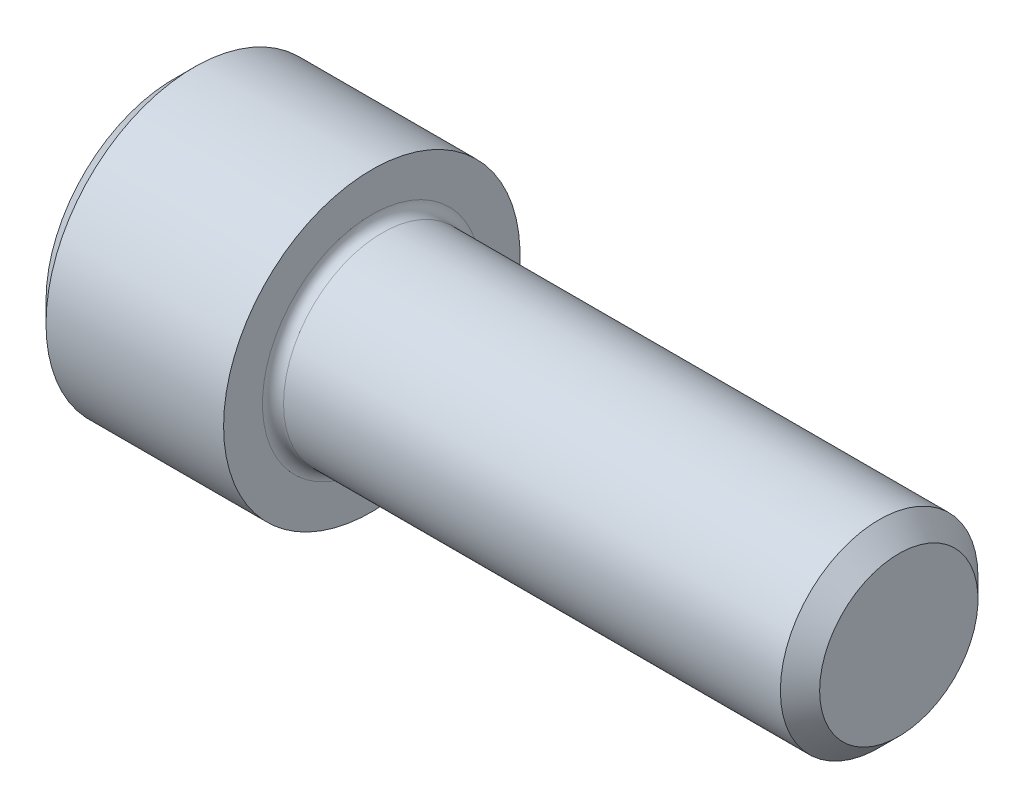
ISO-10303-21;
HEADER;
FILE_DESCRIPTION(('STEP AP214'),'2;1');
FILE_NAME('part.step','',(''),(''),'','','');
FILE_SCHEMA(('AUTOMOTIVE_DESIGN { 1 0 10303 214 1 1 1 1 }'));
ENDSEC;
DATA;
#1=APPLICATION_CONTEXT('core data for automotive mechanical design processes');
#2=APPLICATION_PROTOCOL_DEFINITION('international standard','automotive_design',2000,#1);
#3=PRODUCT_CONTEXT('',#1,'mechanical');
#4=PRODUCT('Part','Part','',(#3));
#5=PRODUCT_RELATED_PRODUCT_CATEGORY('part','',(#4));
#6=PRODUCT_DEFINITION_FORMATION('','',#4);
#7=PRODUCT_DEFINITION_CONTEXT('part definition',#1,'design');
#8=PRODUCT_DEFINITION('design','',#6,#7);
#9=PRODUCT_DEFINITION_SHAPE('','',#8);
#10=(LENGTH_UNIT() NAMED_UNIT(*) SI_UNIT(.MILLI.,.METRE.));
#11=(NAMED_UNIT(*) PLANE_ANGLE_UNIT() SI_UNIT($,.RADIAN.));
#12=(NAMED_UNIT(*) SI_UNIT($,.STERADIAN.) SOLID_ANGLE_UNIT());
#13=UNCERTAINTY_MEASURE_WITH_UNIT(LENGTH_MEASURE(1.E-05),#10,'distance_accuracy_value','');
#14=(GEOMETRIC_REPRESENTATION_CONTEXT(3) GLOBAL_UNCERTAINTY_ASSIGNED_CONTEXT((#13)) GLOBAL_UNIT_ASSIGNED_CONTEXT((#10,
#11,#12)) REPRESENTATION_CONTEXT('',''));
#15=CARTESIAN_POINT('',(0.,0.,0.));
#16=DIRECTION('',(0.,0.,1.));
#17=DIRECTION('',(1.,0.,0.));
#18=AXIS2_PLACEMENT_3D('',#15,#16,#17);
#19=CARTESIAN_POINT('',(-59.1087632408478,-4.02672579360797,7.12011919364386));
#20=DIRECTION('',(-1.,0.,0.));
#21=DIRECTION('',(0.,0.,1.));
#22=AXIS2_PLACEMENT_3D('',#19,#20,#21);
#23=PLANE('',#22);
#24=DIRECTION('',(0.,-0.499999999999998,0.86602540378444));
#25=VECTOR('',#24,1.);
#26=CARTESIAN_POINT('',(-59.1087632408478,0.555991968084691,7.12011919364385));
#27=LINE('',#26,#25);
#28=CARTESIAN_POINT('',(-59.1087632408478,0.555991968084691,7.12011919364385));
#29=VERTEX_POINT('',#28);
#30=CARTESIAN_POINT('',(-59.1087632408478,-1.73536691276163,11.0888691936439));
#31=VERTEX_POINT('',#30);
#32=EDGE_CURVE('E242',#29,#31,#27,.T.);
#33=ORIENTED_EDGE('',*,*,#32,.T.);
#34=DIRECTION('',(0.,1.,0.));
#35=VECTOR('',#34,1.);
#36=CARTESIAN_POINT('',(-59.1087632408478,-6.31808467445428,11.0888691936439));
#37=LINE('',#36,#35);
#38=CARTESIAN_POINT('',(-59.1087632408478,-6.31808467445428,11.0888691936439));
#39=VERTEX_POINT('',#38);
#40=EDGE_CURVE('E112',#39,#31,#37,.T.);
#41=ORIENTED_EDGE('',*,*,#40,.F.);
#42=DIRECTION('',(0.,-0.500000000000001,-0.866025403784438));
#43=VECTOR('',#42,1.);
#44=CARTESIAN_POINT('',(-59.1087632408478,-6.31808467445428,11.0888691936439));
#45=LINE('',#44,#43);
#46=CARTESIAN_POINT('',(-59.1087632408478,-8.60944355530061,7.12011919364386));
#47=VERTEX_POINT('',#46);
#48=EDGE_CURVE('E245',#39,#47,#45,.T.);
#49=ORIENTED_EDGE('',*,*,#48,.T.);
#50=DIRECTION('',(0.,0.499999999999998,-0.86602540378444));
#51=VECTOR('',#50,1.);
#52=CARTESIAN_POINT('',(-59.1087632408478,-8.60944355530061,7.12011919364386));
#53=LINE('',#52,#51);
#54=CARTESIAN_POINT('',(-59.1087632408478,-6.31808467445429,3.15136919364386));
#55=VERTEX_POINT('',#54);
#56=EDGE_CURVE('E248',#47,#55,#53,.T.);
#57=ORIENTED_EDGE('',*,*,#56,.T.);
#58=DIRECTION('',(0.,-1.,0.));
#59=VECTOR('',#58,1.);
#60=CARTESIAN_POINT('',(-59.1087632408478,-1.73536691276164,3.15136919364386));
#61=LINE('',#60,#59);
#62=CARTESIAN_POINT('',(-59.1087632408478,-1.73536691276164,3.15136919364386));
#63=VERTEX_POINT('',#62);
#64=EDGE_CURVE('E251',#63,#55,#61,.T.);
#65=ORIENTED_EDGE('',*,*,#64,.F.);
#66=DIRECTION('',(0.,-0.500000000000001,-0.866025403784438));
#67=VECTOR('',#66,1.);
#68=CARTESIAN_POINT('',(-59.1087632408478,0.555991968084691,7.12011919364385));
#69=LINE('',#68,#67);
#70=EDGE_CURVE('E107',#29,#63,#69,.T.);
#71=ORIENTED_EDGE('',*,*,#70,.F.);
#72=EDGE_LOOP('',(#33,#41,#49,#57,#65,#71));
#73=FACE_BOUND('',#72,.T.);
#74=CARTESIAN_POINT('',(-59.1087632408478,-4.02672579360797,7.12011919364386));
#75=DIRECTION('',(-1.,0.,0.));
#76=DIRECTION('',(0.,0.,1.));
#77=AXIS2_PLACEMENT_3D('',#74,#75,#76);
#78=CIRCLE('',#77,6.17855);
#79=CARTESIAN_POINT('',(-59.1087632408478,-4.02672579360797,13.2986691936439));
#80=VERTEX_POINT('',#79);
#81=EDGE_CURVE('E136',#80,#80,#78,.T.);
#82=ORIENTED_EDGE('',*,*,#81,.T.);
#83=EDGE_LOOP('',(#82));
#84=FACE_BOUND('',#83,.T.);
#85=ADVANCED_FACE('F16',(#73,#84),#23,.T.);
#86=CARTESIAN_POINT('',(-59.1087632408478,-4.02672579360797,7.12011919364386));
#87=DIRECTION('',(1.,0.,0.));
#88=DIRECTION('',(0.,0.,-1.));
#89=AXIS2_PLACEMENT_3D('',#86,#87,#88);
#90=CONICAL_SURFACE('',#89,6.17855,0.785398163397447);
#91=CARTESIAN_POINT('',(-58.1435632408478,-4.02672579360797,7.12011919364386));
#92=DIRECTION('',(-1.,0.,0.));
#93=DIRECTION('',(0.,0.,1.));
#94=AXIS2_PLACEMENT_3D('',#91,#92,#93);
#95=CIRCLE('',#94,7.14375);
#96=CARTESIAN_POINT('',(-58.1435632408478,-4.02672579360797,14.2638691936439));
#97=VERTEX_POINT('',#96);
#98=EDGE_CURVE('E133',#97,#97,#95,.T.);
#99=ORIENTED_EDGE('',*,*,#98,.T.);
#100=EDGE_LOOP('',(#99));
#101=FACE_BOUND('',#100,.T.);
#102=ORIENTED_EDGE('',*,*,#81,.F.);
#103=EDGE_LOOP('',(#102));
#104=FACE_BOUND('',#103,.T.);
#105=ADVANCED_FACE('F158',(#101,#104),#90,.T.);
#106=CARTESIAN_POINT('',(-90.8587632408478,-4.02672579360797,7.12011919364386));
#107=DIRECTION('',(-1.,0.,0.));
#108=DIRECTION('',(0.,0.,1.));
#109=AXIS2_PLACEMENT_3D('',#106,#107,#108);
#110=CYLINDRICAL_SURFACE('',#109,7.14375);
#111=CARTESIAN_POINT('',(-49.5837632408478,-4.02672579360797,7.12011919364386));
#112=DIRECTION('',(-1.,0.,0.));
#113=DIRECTION('',(0.,0.,1.));
#114=AXIS2_PLACEMENT_3D('',#111,#112,#113);
#115=CIRCLE('',#114,7.14375);
#116=CARTESIAN_POINT('',(-49.5837632408478,-4.02672579360797,14.2638691936439));
#117=VERTEX_POINT('',#116);
#118=EDGE_CURVE('E130',#117,#117,#115,.T.);
#119=ORIENTED_EDGE('',*,*,#118,.T.);
#120=EDGE_LOOP('',(#119));
#121=FACE_BOUND('',#120,.T.);
#122=ORIENTED_EDGE('',*,*,#98,.F.);
#123=EDGE_LOOP('',(#122));
#124=FACE_BOUND('',#123,.T.);
#125=ADVANCED_FACE('F163',(#121,#124),#110,.T.);
#126=CARTESIAN_POINT('',(-49.5837632408478,3.11702420639203,7.12011919364386));
#127=DIRECTION('',(1.,0.,0.));
#128=DIRECTION('',(0.,0.,-1.));
#129=AXIS2_PLACEMENT_3D('',#126,#127,#128);
#130=PLANE('',#129);
#131=CARTESIAN_POINT('',(-49.5837632408478,-4.02672579360797,7.12011919364386));
#132=DIRECTION('',(1.,0.,0.));
#133=DIRECTION('',(0.,0.,-1.));
#134=AXIS2_PLACEMENT_3D('',#131,#132,#133);
#135=CIRCLE('',#134,5.27049999999997);
#136=CARTESIAN_POINT('',(-49.5837632408478,-4.02672579360797,1.84961919364389));
#137=VERTEX_POINT('',#136);
#138=EDGE_CURVE('E24',#137,#137,#135,.F.);
#139=ORIENTED_EDGE('',*,*,#138,.T.);
#140=EDGE_LOOP('',(#139));
#141=FACE_BOUND('',#140,.T.);
#142=ORIENTED_EDGE('',*,*,#118,.F.);
#143=EDGE_LOOP('',(#142));
#144=FACE_BOUND('',#143,.T.);
#145=ADVANCED_FACE('F141',(#141,#144),#130,.T.);
#146=CARTESIAN_POINT('',(-90.8587632408478,-4.02672579360797,7.12011919364386));
#147=DIRECTION('',(-1.,0.,0.));
#148=DIRECTION('',(0.,0.,1.));
#149=AXIS2_PLACEMENT_3D('',#146,#147,#148);
#150=CYLINDRICAL_SURFACE('',#149,4.76249999999997);
#151=CARTESIAN_POINT('',(-49.0757632408478,-4.02672579360797,7.12011919364386));
#152=DIRECTION('',(1.,0.,0.));
#153=DIRECTION('',(0.,0.,-1.));
#154=AXIS2_PLACEMENT_3D('',#151,#152,#153);
#155=CIRCLE('',#154,4.76249999999997);
#156=CARTESIAN_POINT('',(-49.0757632408478,-4.02672579360797,2.35761919364389));
#157=VERTEX_POINT('',#156);
#158=EDGE_CURVE('E10',#157,#157,#155,.T.);
#159=ORIENTED_EDGE('',*,*,#158,.T.);
#160=EDGE_LOOP('',(#159));
#161=FACE_BOUND('',#160,.T.);
#162=CARTESIAN_POINT('',(-25.1299132408479,-4.02672579360797,7.12011919364386));
#163=DIRECTION('',(-1.,0.,0.));
#164=DIRECTION('',(0.,0.,1.));
#165=AXIS2_PLACEMENT_3D('',#162,#163,#164);
#166=CIRCLE('',#165,4.76249999999993);
#167=CARTESIAN_POINT('',(-25.1299132408479,-4.02672579360797,11.8826191936438));
#168=VERTEX_POINT('',#167);
#169=EDGE_CURVE('E127',#168,#168,#166,.T.);
#170=ORIENTED_EDGE('',*,*,#169,.T.);
#171=EDGE_LOOP('',(#170));
#172=FACE_BOUND('',#171,.T.);
#173=ADVANCED_FACE('F173',(#161,#172),#150,.T.);
#174=CARTESIAN_POINT('',(-24.1837632408478,-4.02672579360797,7.12011919364386));
#175=DIRECTION('',(-1.,0.,0.));
#176=DIRECTION('',(0.,0.,1.));
#177=AXIS2_PLACEMENT_3D('',#174,#175,#176);
#178=CONICAL_SURFACE('',#177,3.81635,0.785398163397395);
#179=ORIENTED_EDGE('',*,*,#169,.F.);
#180=EDGE_LOOP('',(#179));
#181=FACE_BOUND('',#180,.T.);
#182=CARTESIAN_POINT('',(-24.1837632408478,-4.02672579360797,7.12011919364386));
#183=DIRECTION('',(-1.,0.,0.));
#184=DIRECTION('',(0.,0.,1.));
#185=AXIS2_PLACEMENT_3D('',#182,#183,#184);
#186=CIRCLE('',#185,3.81635);
#187=CARTESIAN_POINT('',(-24.1837632408478,-4.02672579360797,10.9364691936439));
#188=VERTEX_POINT('',#187);
#189=EDGE_CURVE('E123',#188,#188,#186,.T.);
#190=ORIENTED_EDGE('',*,*,#189,.T.);
#191=EDGE_LOOP('',(#190));
#192=FACE_BOUND('',#191,.T.);
#193=ADVANCED_FACE('F153',(#181,#192),#178,.T.);
#194=CARTESIAN_POINT('',(-24.1837632408478,-0.210375793607966,7.12011919364386));
#195=DIRECTION('',(1.,0.,0.));
#196=DIRECTION('',(0.,0.,-1.));
#197=AXIS2_PLACEMENT_3D('',#194,#195,#196);
#198=PLANE('',#197);
#199=ORIENTED_EDGE('',*,*,#189,.F.);
#200=EDGE_LOOP('',(#199));
#201=FACE_BOUND('',#200,.T.);
#202=ADVANCED_FACE('F145',(#201),#198,.T.);
#203=CARTESIAN_POINT('',(-49.0757632408478,-4.02672579360797,7.12011919364386));
#204=DIRECTION('',(1.,0.,0.));
#205=DIRECTION('',(0.,0.,-1.));
#206=AXIS2_PLACEMENT_3D('',#203,#204,#205);
#207=TOROIDAL_SURFACE('',#206,5.27049999999997,0.508);
#208=ORIENTED_EDGE('',*,*,#158,.F.);
#209=EDGE_LOOP('',(#208));
#210=FACE_BOUND('',#209,.T.);
#211=ORIENTED_EDGE('',*,*,#138,.F.);
#212=EDGE_LOOP('',(#211));
#213=FACE_BOUND('',#212,.T.);
#214=ADVANCED_FACE('F18',(#210,#213),#207,.F.);
#215=CARTESIAN_POINT('',(-54.4859632408478,0.555991968084691,7.12011919364385));
#216=DIRECTION('',(0.,-0.86602540378444,-0.499999999999998));
#217=DIRECTION('',(0.,0.499999999999998,-0.86602540378444));
#218=AXIS2_PLACEMENT_3D('',#215,#216,#217);
#219=PLANE('',#218);
#220=ORIENTED_EDGE('',*,*,#32,.F.);
#221=DIRECTION('',(-1.,0.,0.));
#222=VECTOR('',#221,1.);
#223=CARTESIAN_POINT('',(-54.4859632408478,0.555991968084691,7.12011919364385));
#224=LINE('',#223,#222);
#225=CARTESIAN_POINT('',(-54.4859632408478,0.555991968084691,7.12011919364385));
#226=VERTEX_POINT('',#225);
#227=EDGE_CURVE('E232',#226,#29,#224,.T.);
#228=ORIENTED_EDGE('',*,*,#227,.F.);
#229=DIRECTION('',(0.,-0.499999999999998,0.86602540378444));
#230=VECTOR('',#229,1.);
#231=CARTESIAN_POINT('',(-54.4859632408478,0.555991968084691,7.12011919364385));
#232=LINE('',#231,#230);
#233=CARTESIAN_POINT('',(-54.4859632408478,-0.58968747233847,9.10449419364385));
#234=VERTEX_POINT('',#233);
#235=EDGE_CURVE('E99',#226,#234,#232,.T.);
#236=ORIENTED_EDGE('',*,*,#235,.T.);
#237=CARTESIAN_POINT('',(-54.4859632408478,-1.73536691276163,11.0888691936439));
#238=VERTEX_POINT('',#237);
#239=EDGE_CURVE('E90',#234,#238,#232,.T.);
#240=ORIENTED_EDGE('',*,*,#239,.T.);
#241=DIRECTION('',(-1.,0.,0.));
#242=VECTOR('',#241,1.);
#243=CARTESIAN_POINT('',(-54.4859632408478,-1.73536691276163,11.0888691936439));
#244=LINE('',#243,#242);
#245=EDGE_CURVE('E104',#238,#31,#244,.T.);
#246=ORIENTED_EDGE('',*,*,#245,.T.);
#247=EDGE_LOOP('',(#220,#228,#236,#240,#246));
#248=FACE_BOUND('',#247,.T.);
#249=ADVANCED_FACE('F103',(#248),#219,.T.);
#250=CARTESIAN_POINT('',(-54.4859632408478,-6.31808467445428,11.0888691936439));
#251=DIRECTION('',(0.,0.,1.));
#252=DIRECTION('',(0.,-1.,0.));
#253=AXIS2_PLACEMENT_3D('',#250,#251,#252);
#254=PLANE('',#253);
#255=ORIENTED_EDGE('',*,*,#40,.T.);
#256=ORIENTED_EDGE('',*,*,#245,.F.);
#257=DIRECTION('',(0.,1.,0.));
#258=VECTOR('',#257,1.);
#259=CARTESIAN_POINT('',(-54.4859632408478,-6.31808467445428,11.0888691936439));
#260=LINE('',#259,#258);
#261=CARTESIAN_POINT('',(-54.4859632408478,-4.02672579360796,11.0888691936439));
#262=VERTEX_POINT('',#261);
#263=EDGE_CURVE('E87',#262,#238,#260,.T.);
#264=ORIENTED_EDGE('',*,*,#263,.F.);
#265=CARTESIAN_POINT('',(-54.4859632408478,-6.31808467445428,11.0888691936439));
#266=VERTEX_POINT('',#265);
#267=EDGE_CURVE('E98',#266,#262,#260,.T.);
#268=ORIENTED_EDGE('',*,*,#267,.F.);
#269=DIRECTION('',(-1.,0.,0.));
#270=VECTOR('',#269,1.);
#271=CARTESIAN_POINT('',(-54.4859632408478,-6.31808467445428,11.0888691936439));
#272=LINE('',#271,#270);
#273=EDGE_CURVE('E114',#266,#39,#272,.T.);
#274=ORIENTED_EDGE('',*,*,#273,.T.);
#275=EDGE_LOOP('',(#255,#256,#264,#268,#274));
#276=FACE_BOUND('',#275,.T.);
#277=ADVANCED_FACE('F109',(#276),#254,.F.);
#278=CARTESIAN_POINT('',(-54.4859632408478,-6.31808467445428,11.0888691936439));
#279=DIRECTION('',(0.,0.866025403784438,-0.500000000000001));
#280=DIRECTION('',(0.,0.500000000000001,0.866025403784438));
#281=AXIS2_PLACEMENT_3D('',#278,#279,#280);
#282=PLANE('',#281);
#283=ORIENTED_EDGE('',*,*,#48,.F.);
#284=ORIENTED_EDGE('',*,*,#273,.F.);
#285=DIRECTION('',(0.,-0.500000000000001,-0.866025403784438));
#286=VECTOR('',#285,1.);
#287=CARTESIAN_POINT('',(-54.4859632408478,-6.31808467445428,11.0888691936439));
#288=LINE('',#287,#286);
#289=CARTESIAN_POINT('',(-54.4859632408478,-7.46376411487745,9.10449419364386));
#290=VERTEX_POINT('',#289);
#291=EDGE_CURVE('E271',#266,#290,#288,.T.);
#292=ORIENTED_EDGE('',*,*,#291,.T.);
#293=CARTESIAN_POINT('',(-54.4859632408478,-8.60944355530061,7.12011919364386));
#294=VERTEX_POINT('',#293);
#295=EDGE_CURVE('E260',#290,#294,#288,.T.);
#296=ORIENTED_EDGE('',*,*,#295,.T.);
#297=DIRECTION('',(-1.,0.,0.));
#298=VECTOR('',#297,1.);
#299=CARTESIAN_POINT('',(-54.4859632408478,-8.60944355530061,7.12011919364386));
#300=LINE('',#299,#298);
#301=EDGE_CURVE('E119',#294,#47,#300,.T.);
#302=ORIENTED_EDGE('',*,*,#301,.T.);
#303=EDGE_LOOP('',(#283,#284,#292,#296,#302));
#304=FACE_BOUND('',#303,.T.);
#305=ADVANCED_FACE('F186',(#304),#282,.T.);
#306=CARTESIAN_POINT('',(-54.4859632408478,-8.60944355530061,7.12011919364386));
#307=DIRECTION('',(0.,0.86602540378444,0.499999999999998));
#308=DIRECTION('',(0.,-0.499999999999998,0.86602540378444));
#309=AXIS2_PLACEMENT_3D('',#306,#307,#308);
#310=PLANE('',#309);
#311=ORIENTED_EDGE('',*,*,#56,.F.);
#312=ORIENTED_EDGE('',*,*,#301,.F.);
#313=DIRECTION('',(0.,0.499999999999998,-0.86602540378444));
#314=VECTOR('',#313,1.);
#315=CARTESIAN_POINT('',(-54.4859632408478,-8.60944355530061,7.12011919364386));
#316=LINE('',#315,#314);
#317=CARTESIAN_POINT('',(-54.4859632408478,-7.46376411487746,5.13574419364387));
#318=VERTEX_POINT('',#317);
#319=EDGE_CURVE('E238',#294,#318,#316,.T.);
#320=ORIENTED_EDGE('',*,*,#319,.T.);
#321=CARTESIAN_POINT('',(-54.4859632408478,-6.31808467445429,3.15136919364386));
#322=VERTEX_POINT('',#321);
#323=EDGE_CURVE('E270',#318,#322,#316,.T.);
#324=ORIENTED_EDGE('',*,*,#323,.T.);
#325=DIRECTION('',(-1.,0.,0.));
#326=VECTOR('',#325,1.);
#327=CARTESIAN_POINT('',(-54.4859632408478,-6.31808467445429,3.15136919364386));
#328=LINE('',#327,#326);
#329=EDGE_CURVE('E231',#322,#55,#328,.T.);
#330=ORIENTED_EDGE('',*,*,#329,.T.);
#331=EDGE_LOOP('',(#311,#312,#320,#324,#330));
#332=FACE_BOUND('',#331,.T.);
#333=ADVANCED_FACE('F189',(#332),#310,.T.);
#334=CARTESIAN_POINT('',(-54.4859632408478,-1.73536691276164,3.15136919364386));
#335=DIRECTION('',(0.,0.,-1.));
#336=DIRECTION('',(0.,1.,0.));
#337=AXIS2_PLACEMENT_3D('',#334,#335,#336);
#338=PLANE('',#337);
#339=ORIENTED_EDGE('',*,*,#64,.T.);
#340=ORIENTED_EDGE('',*,*,#329,.F.);
#341=DIRECTION('',(0.,-1.,0.));
#342=VECTOR('',#341,1.);
#343=CARTESIAN_POINT('',(-54.4859632408478,-1.73536691276164,3.15136919364386));
#344=LINE('',#343,#342);
#345=CARTESIAN_POINT('',(-54.4859632408478,-4.02672579360797,3.15136919364386));
#346=VERTEX_POINT('',#345);
#347=EDGE_CURVE('E235',#346,#322,#344,.T.);
#348=ORIENTED_EDGE('',*,*,#347,.F.);
#349=CARTESIAN_POINT('',(-54.4859632408478,-1.73536691276164,3.15136919364386));
#350=VERTEX_POINT('',#349);
#351=EDGE_CURVE('E31',#350,#346,#344,.T.);
#352=ORIENTED_EDGE('',*,*,#351,.F.);
#353=DIRECTION('',(-1.,0.,0.));
#354=VECTOR('',#353,1.);
#355=CARTESIAN_POINT('',(-54.4859632408478,-1.73536691276164,3.15136919364386));
#356=LINE('',#355,#354);
#357=EDGE_CURVE('E228',#350,#63,#356,.T.);
#358=ORIENTED_EDGE('',*,*,#357,.T.);
#359=EDGE_LOOP('',(#339,#340,#348,#352,#358));
#360=FACE_BOUND('',#359,.T.);
#361=ADVANCED_FACE('F193',(#360),#338,.F.);
#362=CARTESIAN_POINT('',(-54.4859632408478,0.555991968084691,7.12011919364385));
#363=DIRECTION('',(0.,0.866025403784438,-0.500000000000001));
#364=DIRECTION('',(0.,0.500000000000001,0.866025403784438));
#365=AXIS2_PLACEMENT_3D('',#362,#363,#364);
#366=PLANE('',#365);
#367=ORIENTED_EDGE('',*,*,#70,.T.);
#368=ORIENTED_EDGE('',*,*,#357,.F.);
#369=DIRECTION('',(0.,-0.500000000000001,-0.866025403784438));
#370=VECTOR('',#369,1.);
#371=CARTESIAN_POINT('',(-54.4859632408478,0.555991968084691,7.12011919364385));
#372=LINE('',#371,#370);
#373=CARTESIAN_POINT('',(-54.4859632408478,-0.589687472338474,5.13574419364385));
#374=VERTEX_POINT('',#373);
#375=EDGE_CURVE('E218',#374,#350,#372,.T.);
#376=ORIENTED_EDGE('',*,*,#375,.F.);
#377=EDGE_CURVE('E224',#226,#374,#372,.T.);
#378=ORIENTED_EDGE('',*,*,#377,.F.);
#379=ORIENTED_EDGE('',*,*,#227,.T.);
#380=EDGE_LOOP('',(#367,#368,#376,#378,#379));
#381=FACE_BOUND('',#380,.T.);
#382=ADVANCED_FACE('F197',(#381),#366,.F.);
#383=CARTESIAN_POINT('',(-54.4859632408478,2.84735084893101,3.15136919364385));
#384=DIRECTION('',(1.,0.,0.));
#385=DIRECTION('',(0.,0.,-1.));
#386=AXIS2_PLACEMENT_3D('',#383,#384,#385);
#387=PLANE('',#386);
#388=ORIENTED_EDGE('',*,*,#347,.T.);
#389=ORIENTED_EDGE('',*,*,#323,.F.);
#390=CARTESIAN_POINT('',(-54.4859632408478,-4.02672579360797,7.12011919364386));
#391=DIRECTION('',(-1.,0.,0.));
#392=DIRECTION('',(0.,0.,1.));
#393=AXIS2_PLACEMENT_3D('',#390,#391,#392);
#394=CIRCLE('',#393,3.96875);
#395=EDGE_CURVE('E266',#346,#318,#394,.T.);
#396=ORIENTED_EDGE('',*,*,#395,.F.);
#397=EDGE_LOOP('',(#388,#389,#396));
#398=FACE_BOUND('',#397,.T.);
#399=ADVANCED_FACE('F201',(#398),#387,.F.);
#400=ORIENTED_EDGE('',*,*,#319,.F.);
#401=ORIENTED_EDGE('',*,*,#295,.F.);
#402=EDGE_CURVE('E117',#318,#290,#394,.T.);
#403=ORIENTED_EDGE('',*,*,#402,.F.);
#404=EDGE_LOOP('',(#400,#401,#403));
#405=FACE_BOUND('',#404,.T.);
#406=ADVANCED_FACE('F204',(#405),#387,.F.);
#407=ORIENTED_EDGE('',*,*,#291,.F.);
#408=ORIENTED_EDGE('',*,*,#267,.T.);
#409=EDGE_CURVE('E113',#290,#262,#394,.T.);
#410=ORIENTED_EDGE('',*,*,#409,.F.);
#411=EDGE_LOOP('',(#407,#408,#410));
#412=FACE_BOUND('',#411,.T.);
#413=ADVANCED_FACE('F209',(#412),#387,.F.);
#414=ORIENTED_EDGE('',*,*,#263,.T.);
#415=ORIENTED_EDGE('',*,*,#239,.F.);
#416=EDGE_CURVE('E93',#262,#234,#394,.T.);
#417=ORIENTED_EDGE('',*,*,#416,.F.);
#418=EDGE_LOOP('',(#414,#415,#417));
#419=FACE_BOUND('',#418,.T.);
#420=ADVANCED_FACE('F89',(#419),#387,.F.);
#421=ORIENTED_EDGE('',*,*,#235,.F.);
#422=ORIENTED_EDGE('',*,*,#377,.T.);
#423=EDGE_CURVE('E124',#234,#374,#394,.T.);
#424=ORIENTED_EDGE('',*,*,#423,.F.);
#425=EDGE_LOOP('',(#421,#422,#424));
#426=FACE_BOUND('',#425,.T.);
#427=ADVANCED_FACE('F212',(#426),#387,.F.);
#428=ORIENTED_EDGE('',*,*,#375,.T.);
#429=ORIENTED_EDGE('',*,*,#351,.T.);
#430=EDGE_CURVE('E221',#374,#346,#394,.T.);
#431=ORIENTED_EDGE('',*,*,#430,.F.);
#432=EDGE_LOOP('',(#428,#429,#431));
#433=FACE_BOUND('',#432,.T.);
#434=ADVANCED_FACE('F182',(#433),#387,.F.);
#435=CARTESIAN_POINT('',(-54.4859632408478,-4.02672579360797,7.12011919364386));
#436=DIRECTION('',(-1.,0.,0.));
#437=DIRECTION('',(0.,0.,1.));
#438=AXIS2_PLACEMENT_3D('',#435,#436,#437);
#439=CONICAL_SURFACE('',#438,3.96875,1.04719755119659);
#440=CARTESIAN_POINT('',(-52.1946043600015,-4.02672579360797,7.12011919364386));
#441=VERTEX_POINT('',#440);
#442=VERTEX_LOOP('',#441);
#443=FACE_BOUND('',#442,.T.);
#444=ORIENTED_EDGE('',*,*,#416,.T.);
#445=ORIENTED_EDGE('',*,*,#423,.T.);
#446=ORIENTED_EDGE('',*,*,#430,.T.);
#447=ORIENTED_EDGE('',*,*,#395,.T.);
#448=ORIENTED_EDGE('',*,*,#402,.T.);
#449=ORIENTED_EDGE('',*,*,#409,.T.);
#450=EDGE_LOOP('',(#444,#445,#446,#447,#448,#449));
#451=FACE_BOUND('',#450,.T.);
#452=ADVANCED_FACE('F180',(#443,#451),#439,.F.);
#453=CLOSED_SHELL('',(#85,#105,#125,#145,#173,#193,#202,#214,#249,#277,#305,#333,#361,#382,#399,
#406,#413,#420,#427,#434,#452));
#454=MANIFOLD_SOLID_BREP('B1',#453);
#455=ADVANCED_BREP_SHAPE_REPRESENTATION('',(#18,#454),#14);
#456=SHAPE_DEFINITION_REPRESENTATION(#9,#455);
ENDSEC;
END-ISO-10303-21;
